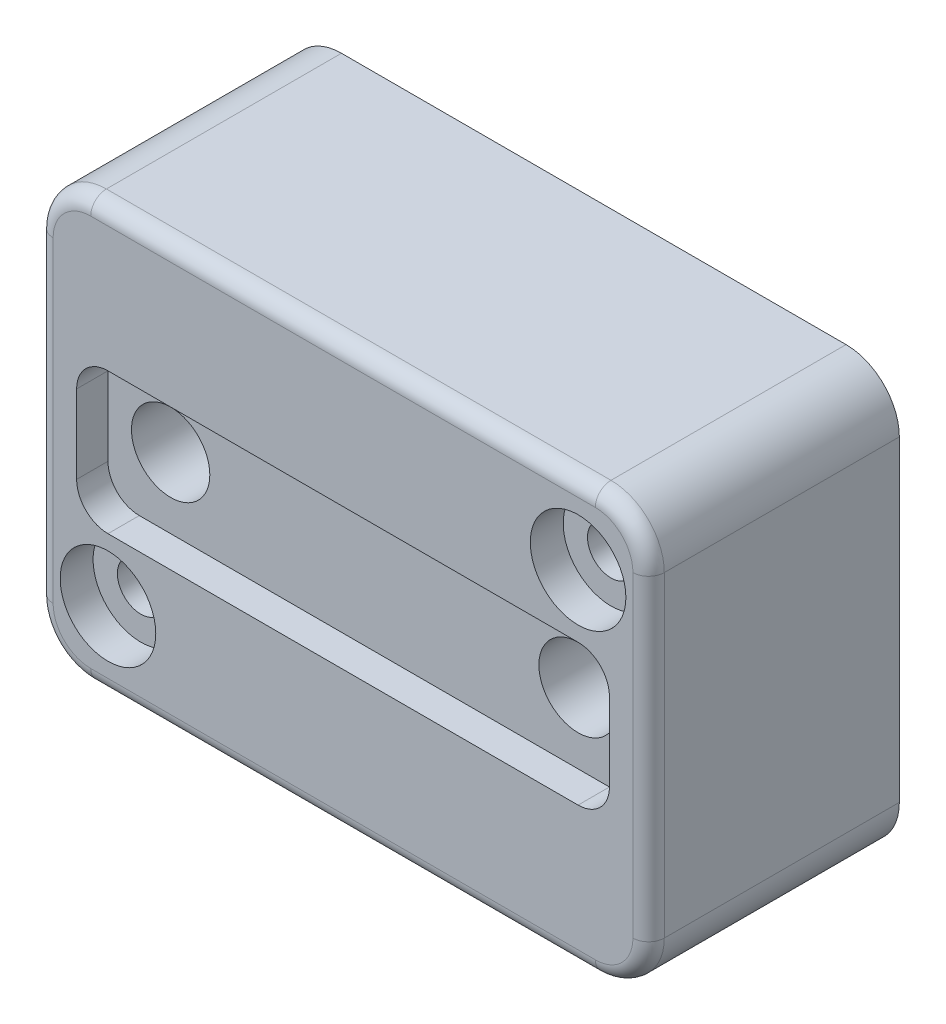
ISO-10303-21;
HEADER;
FILE_DESCRIPTION(('STEP AP214'),'2;1');
FILE_NAME('part.step','',(''),(''),'','','');
FILE_SCHEMA(('AUTOMOTIVE_DESIGN { 1 0 10303 214 1 1 1 1 }'));
ENDSEC;
DATA;
#1=APPLICATION_CONTEXT('core data for automotive mechanical design processes');
#2=APPLICATION_PROTOCOL_DEFINITION('international standard','automotive_design',2000,#1);
#3=PRODUCT_CONTEXT('',#1,'mechanical');
#4=PRODUCT('Part','Part','',(#3));
#5=PRODUCT_RELATED_PRODUCT_CATEGORY('part','',(#4));
#6=PRODUCT_DEFINITION_FORMATION('','',#4);
#7=PRODUCT_DEFINITION_CONTEXT('part definition',#1,'design');
#8=PRODUCT_DEFINITION('design','',#6,#7);
#9=PRODUCT_DEFINITION_SHAPE('','',#8);
#10=(LENGTH_UNIT() NAMED_UNIT(*) SI_UNIT(.MILLI.,.METRE.));
#11=(NAMED_UNIT(*) PLANE_ANGLE_UNIT() SI_UNIT($,.RADIAN.));
#12=(NAMED_UNIT(*) SI_UNIT($,.STERADIAN.) SOLID_ANGLE_UNIT());
#13=UNCERTAINTY_MEASURE_WITH_UNIT(LENGTH_MEASURE(1.E-05),#10,'distance_accuracy_value','');
#14=(GEOMETRIC_REPRESENTATION_CONTEXT(3) GLOBAL_UNCERTAINTY_ASSIGNED_CONTEXT((#13)) GLOBAL_UNIT_ASSIGNED_CONTEXT((#10,
#11,#12)) REPRESENTATION_CONTEXT('',''));
#15=CARTESIAN_POINT('',(0.,0.,0.));
#16=DIRECTION('',(0.,0.,1.));
#17=DIRECTION('',(1.,0.,0.));
#18=AXIS2_PLACEMENT_3D('',#15,#16,#17);
#19=CARTESIAN_POINT('',(15.,8.5,16.));
#20=DIRECTION('',(0.,0.,-1.));
#21=DIRECTION('',(-1.,0.,0.));
#22=AXIS2_PLACEMENT_3D('',#19,#20,#21);
#23=CYLINDRICAL_SURFACE('',#22,1.5);
#24=CARTESIAN_POINT('',(15.,8.5,0.));
#25=DIRECTION('',(0.,0.,1.));
#26=DIRECTION('',(1.,0.,0.));
#27=AXIS2_PLACEMENT_3D('',#24,#25,#26);
#28=CIRCLE('',#27,1.5);
#29=CARTESIAN_POINT('',(16.5,8.5,0.));
#30=VERTEX_POINT('',#29);
#31=EDGE_CURVE('E253',#30,#30,#28,.T.);
#32=ORIENTED_EDGE('',*,*,#31,.F.);
#33=EDGE_LOOP('',(#32));
#34=FACE_BOUND('',#33,.T.);
#35=CARTESIAN_POINT('',(15.,8.5,13.9));
#36=DIRECTION('',(0.,0.,1.));
#37=DIRECTION('',(1.,0.,0.));
#38=AXIS2_PLACEMENT_3D('',#35,#36,#37);
#39=CIRCLE('',#38,1.5);
#40=CARTESIAN_POINT('',(16.5,8.5,13.9));
#41=VERTEX_POINT('',#40);
#42=EDGE_CURVE('E300',#41,#41,#39,.T.);
#43=ORIENTED_EDGE('',*,*,#42,.T.);
#44=EDGE_LOOP('',(#43));
#45=FACE_BOUND('',#44,.T.);
#46=ADVANCED_FACE('F33',(#34,#45),#23,.F.);
#47=CARTESIAN_POINT('',(-15.,-8.5,16.));
#48=DIRECTION('',(0.,0.,-1.));
#49=DIRECTION('',(-1.,0.,0.));
#50=AXIS2_PLACEMENT_3D('',#47,#48,#49);
#51=CYLINDRICAL_SURFACE('',#50,1.5);
#52=CARTESIAN_POINT('',(-15.,-8.5,0.));
#53=DIRECTION('',(0.,0.,1.));
#54=DIRECTION('',(1.,0.,0.));
#55=AXIS2_PLACEMENT_3D('',#52,#53,#54);
#56=CIRCLE('',#55,1.5);
#57=CARTESIAN_POINT('',(-13.5,-8.5,0.));
#58=VERTEX_POINT('',#57);
#59=EDGE_CURVE('E239',#58,#58,#56,.T.);
#60=ORIENTED_EDGE('',*,*,#59,.F.);
#61=EDGE_LOOP('',(#60));
#62=FACE_BOUND('',#61,.T.);
#63=CARTESIAN_POINT('',(-15.,-8.5,13.9));
#64=DIRECTION('',(0.,0.,1.));
#65=DIRECTION('',(1.,0.,0.));
#66=AXIS2_PLACEMENT_3D('',#63,#64,#65);
#67=CIRCLE('',#66,1.5);
#68=CARTESIAN_POINT('',(-13.5,-8.5,13.9));
#69=VERTEX_POINT('',#68);
#70=EDGE_CURVE('E297',#69,#69,#67,.T.);
#71=ORIENTED_EDGE('',*,*,#70,.T.);
#72=EDGE_LOOP('',(#71));
#73=FACE_BOUND('',#72,.T.);
#74=ADVANCED_FACE('F384',(#62,#73),#51,.F.);
#75=CARTESIAN_POINT('',(15.,2.5,14.));
#76=DIRECTION('',(0.,0.,-1.));
#77=DIRECTION('',(-1.,0.,0.));
#78=AXIS2_PLACEMENT_3D('',#75,#76,#77);
#79=PLANE('',#78);
#80=CARTESIAN_POINT('',(-13.,0.,14.));
#81=DIRECTION('',(0.,0.,1.));
#82=DIRECTION('',(1.,0.,0.));
#83=AXIS2_PLACEMENT_3D('',#80,#81,#82);
#84=CIRCLE('',#83,2.5);
#85=CARTESIAN_POINT('',(-10.5,0.,14.));
#86=VERTEX_POINT('',#85);
#87=EDGE_CURVE('E372',#86,#86,#84,.T.);
#88=ORIENTED_EDGE('',*,*,#87,.F.);
#89=EDGE_LOOP('',(#88));
#90=FACE_BOUND('',#89,.T.);
#91=CARTESIAN_POINT('',(15.,2.5,14.));
#92=DIRECTION('',(0.,0.,1.));
#93=DIRECTION('',(-1.,0.,0.));
#94=AXIS2_PLACEMENT_3D('',#91,#92,#93);
#95=CIRCLE('',#94,2.);
#96=CARTESIAN_POINT('',(17.,2.49999999999998,14.));
#97=VERTEX_POINT('',#96);
#98=CARTESIAN_POINT('',(15.,4.5,14.));
#99=VERTEX_POINT('',#98);
#100=EDGE_CURVE('E175',#97,#99,#95,.T.);
#101=ORIENTED_EDGE('',*,*,#100,.T.);
#102=DIRECTION('',(-1.,0.,0.));
#103=VECTOR('',#102,1.);
#104=CARTESIAN_POINT('',(-15.,4.5,14.));
#105=LINE('',#104,#103);
#106=CARTESIAN_POINT('',(-15.,4.5,14.));
#107=VERTEX_POINT('',#106);
#108=EDGE_CURVE('E186',#99,#107,#105,.T.);
#109=ORIENTED_EDGE('',*,*,#108,.T.);
#110=CARTESIAN_POINT('',(-15.,2.5,14.));
#111=DIRECTION('',(0.,0.,1.));
#112=DIRECTION('',(1.,0.,0.));
#113=AXIS2_PLACEMENT_3D('',#110,#111,#112);
#114=CIRCLE('',#113,2.);
#115=CARTESIAN_POINT('',(-17.,2.49999999999998,14.));
#116=VERTEX_POINT('',#115);
#117=EDGE_CURVE('E191',#107,#116,#114,.T.);
#118=ORIENTED_EDGE('',*,*,#117,.T.);
#119=DIRECTION('',(0.,-1.,0.));
#120=VECTOR('',#119,1.);
#121=CARTESIAN_POINT('',(-17.,2.49999999999998,14.));
#122=LINE('',#121,#120);
#123=CARTESIAN_POINT('',(-17.,-2.49999999999999,14.));
#124=VERTEX_POINT('',#123);
#125=EDGE_CURVE('E207',#116,#124,#122,.T.);
#126=ORIENTED_EDGE('',*,*,#125,.T.);
#127=CARTESIAN_POINT('',(-15.,-2.5,14.));
#128=DIRECTION('',(0.,0.,1.));
#129=DIRECTION('',(1.,0.,0.));
#130=AXIS2_PLACEMENT_3D('',#127,#128,#129);
#131=CIRCLE('',#130,2.);
#132=CARTESIAN_POINT('',(-15.,-4.5,14.));
#133=VERTEX_POINT('',#132);
#134=EDGE_CURVE('E210',#124,#133,#131,.T.);
#135=ORIENTED_EDGE('',*,*,#134,.T.);
#136=DIRECTION('',(1.,0.,0.));
#137=VECTOR('',#136,1.);
#138=CARTESIAN_POINT('',(-15.,-4.5,14.));
#139=LINE('',#138,#137);
#140=CARTESIAN_POINT('',(15.,-4.5,14.));
#141=VERTEX_POINT('',#140);
#142=EDGE_CURVE('E213',#133,#141,#139,.T.);
#143=ORIENTED_EDGE('',*,*,#142,.T.);
#144=CARTESIAN_POINT('',(15.,-2.5,14.));
#145=DIRECTION('',(0.,0.,1.));
#146=DIRECTION('',(1.,0.,0.));
#147=AXIS2_PLACEMENT_3D('',#144,#145,#146);
#148=CIRCLE('',#147,2.);
#149=CARTESIAN_POINT('',(17.,-2.5,14.));
#150=VERTEX_POINT('',#149);
#151=EDGE_CURVE('E216',#141,#150,#148,.T.);
#152=ORIENTED_EDGE('',*,*,#151,.T.);
#153=DIRECTION('',(0.,1.,0.));
#154=VECTOR('',#153,1.);
#155=CARTESIAN_POINT('',(17.,2.49999999999998,14.));
#156=LINE('',#155,#154);
#157=EDGE_CURVE('E183',#150,#97,#156,.T.);
#158=ORIENTED_EDGE('',*,*,#157,.T.);
#159=EDGE_LOOP('',(#101,#109,#118,#126,#135,#143,#152,#158));
#160=FACE_BOUND('',#159,.T.);
#161=CARTESIAN_POINT('',(13.,0.,14.));
#162=DIRECTION('',(0.,0.,1.));
#163=DIRECTION('',(-1.,0.,0.));
#164=AXIS2_PLACEMENT_3D('',#161,#162,#163);
#165=CIRCLE('',#164,2.5);
#166=CARTESIAN_POINT('',(10.5,0.,14.));
#167=VERTEX_POINT('',#166);
#168=EDGE_CURVE('E203',#167,#167,#165,.T.);
#169=ORIENTED_EDGE('',*,*,#168,.F.);
#170=EDGE_LOOP('',(#169));
#171=FACE_BOUND('',#170,.T.);
#172=ADVANCED_FACE('F193',(#90,#160,#171),#79,.F.);
#173=CARTESIAN_POINT('',(16.1,10.1,16.));
#174=DIRECTION('',(0.,0.,-1.));
#175=DIRECTION('',(-1.,0.,0.));
#176=AXIS2_PLACEMENT_3D('',#173,#174,#175);
#177=PLANE('',#176);
#178=DIRECTION('',(1.,0.,0.));
#179=VECTOR('',#178,1.);
#180=CARTESIAN_POINT('',(16.1,-12.5,16.));
#181=LINE('',#180,#179);
#182=CARTESIAN_POINT('',(-16.1,-12.5,16.));
#183=VERTEX_POINT('',#182);
#184=CARTESIAN_POINT('',(16.1,-12.5,16.));
#185=VERTEX_POINT('',#184);
#186=EDGE_CURVE('E314',#183,#185,#181,.T.);
#187=ORIENTED_EDGE('',*,*,#186,.T.);
#188=CARTESIAN_POINT('',(16.1,-10.1,16.));
#189=DIRECTION('',(0.,0.,-1.));
#190=DIRECTION('',(-1.,0.,0.));
#191=AXIS2_PLACEMENT_3D('',#188,#189,#190);
#192=CIRCLE('',#191,2.4);
#193=CARTESIAN_POINT('',(18.5,-10.1,16.));
#194=VERTEX_POINT('',#193);
#195=EDGE_CURVE('E318',#185,#194,#192,.F.);
#196=ORIENTED_EDGE('',*,*,#195,.T.);
#197=DIRECTION('',(0.,1.,0.));
#198=VECTOR('',#197,1.);
#199=CARTESIAN_POINT('',(18.5,10.1,16.));
#200=LINE('',#199,#198);
#201=CARTESIAN_POINT('',(18.5,10.1,16.));
#202=VERTEX_POINT('',#201);
#203=EDGE_CURVE('E316',#194,#202,#200,.T.);
#204=ORIENTED_EDGE('',*,*,#203,.T.);
#205=CARTESIAN_POINT('',(16.1,10.1,16.));
#206=DIRECTION('',(0.,0.,-1.));
#207=DIRECTION('',(-1.,0.,0.));
#208=AXIS2_PLACEMENT_3D('',#205,#206,#207);
#209=CIRCLE('',#208,2.4);
#210=CARTESIAN_POINT('',(16.1,12.5,16.));
#211=VERTEX_POINT('',#210);
#212=EDGE_CURVE('E312',#202,#211,#209,.F.);
#213=ORIENTED_EDGE('',*,*,#212,.T.);
#214=DIRECTION('',(-1.,0.,0.));
#215=VECTOR('',#214,1.);
#216=CARTESIAN_POINT('',(16.1,12.5,16.));
#217=LINE('',#216,#215);
#218=CARTESIAN_POINT('',(-16.1,12.5,16.));
#219=VERTEX_POINT('',#218);
#220=EDGE_CURVE('E310',#211,#219,#217,.T.);
#221=ORIENTED_EDGE('',*,*,#220,.T.);
#222=CARTESIAN_POINT('',(-16.1,10.1,16.));
#223=DIRECTION('',(0.,0.,-1.));
#224=DIRECTION('',(-1.,0.,0.));
#225=AXIS2_PLACEMENT_3D('',#222,#223,#224);
#226=CIRCLE('',#225,2.4);
#227=CARTESIAN_POINT('',(-18.5,10.1,16.));
#228=VERTEX_POINT('',#227);
#229=EDGE_CURVE('E307',#219,#228,#226,.F.);
#230=ORIENTED_EDGE('',*,*,#229,.T.);
#231=DIRECTION('',(0.,-1.,0.));
#232=VECTOR('',#231,1.);
#233=CARTESIAN_POINT('',(-18.5,10.1,16.));
#234=LINE('',#233,#232);
#235=CARTESIAN_POINT('',(-18.5,-10.1,16.));
#236=VERTEX_POINT('',#235);
#237=EDGE_CURVE('E296',#228,#236,#234,.T.);
#238=ORIENTED_EDGE('',*,*,#237,.T.);
#239=CARTESIAN_POINT('',(-16.1,-10.1,16.));
#240=DIRECTION('',(0.,0.,-1.));
#241=DIRECTION('',(-1.,0.,0.));
#242=AXIS2_PLACEMENT_3D('',#239,#240,#241);
#243=CIRCLE('',#242,2.4);
#244=EDGE_CURVE('E305',#236,#183,#243,.F.);
#245=ORIENTED_EDGE('',*,*,#244,.T.);
#246=EDGE_LOOP('',(#187,#196,#204,#213,#221,#230,#238,#245));
#247=FACE_BOUND('',#246,.T.);
#248=CARTESIAN_POINT('',(15.,8.5,16.));
#249=DIRECTION('',(0.,0.,1.));
#250=DIRECTION('',(1.,0.,0.));
#251=AXIS2_PLACEMENT_3D('',#248,#249,#250);
#252=CIRCLE('',#251,3.05);
#253=CARTESIAN_POINT('',(18.05,8.5,16.));
#254=VERTEX_POINT('',#253);
#255=EDGE_CURVE('E366',#254,#254,#252,.T.);
#256=ORIENTED_EDGE('',*,*,#255,.F.);
#257=EDGE_LOOP('',(#256));
#258=FACE_BOUND('',#257,.T.);
#259=CARTESIAN_POINT('',(-15.,-8.5,16.));
#260=DIRECTION('',(0.,0.,1.));
#261=DIRECTION('',(1.,0.,0.));
#262=AXIS2_PLACEMENT_3D('',#259,#260,#261);
#263=CIRCLE('',#262,3.05);
#264=CARTESIAN_POINT('',(-11.95,-8.5,16.));
#265=VERTEX_POINT('',#264);
#266=EDGE_CURVE('E355',#265,#265,#263,.T.);
#267=ORIENTED_EDGE('',*,*,#266,.F.);
#268=EDGE_LOOP('',(#267));
#269=FACE_BOUND('',#268,.T.);
#270=DIRECTION('',(-1.,0.,0.));
#271=VECTOR('',#270,1.);
#272=CARTESIAN_POINT('',(-15.,4.5,16.));
#273=LINE('',#272,#271);
#274=CARTESIAN_POINT('',(15.,4.5,16.));
#275=VERTEX_POINT('',#274);
#276=CARTESIAN_POINT('',(-15.,4.5,16.));
#277=VERTEX_POINT('',#276);
#278=EDGE_CURVE('E220',#275,#277,#273,.T.);
#279=ORIENTED_EDGE('',*,*,#278,.F.);
#280=CARTESIAN_POINT('',(15.,2.5,16.));
#281=DIRECTION('',(0.,0.,1.));
#282=DIRECTION('',(-1.,0.,0.));
#283=AXIS2_PLACEMENT_3D('',#280,#281,#282);
#284=CIRCLE('',#283,2.);
#285=CARTESIAN_POINT('',(17.,2.49999999999998,16.));
#286=VERTEX_POINT('',#285);
#287=EDGE_CURVE('E178',#286,#275,#284,.T.);
#288=ORIENTED_EDGE('',*,*,#287,.F.);
#289=DIRECTION('',(0.,1.,0.));
#290=VECTOR('',#289,1.);
#291=CARTESIAN_POINT('',(17.,2.49999999999998,16.));
#292=LINE('',#291,#290);
#293=CARTESIAN_POINT('',(17.,-2.5,16.));
#294=VERTEX_POINT('',#293);
#295=EDGE_CURVE('E197',#294,#286,#292,.T.);
#296=ORIENTED_EDGE('',*,*,#295,.F.);
#297=CARTESIAN_POINT('',(15.,-2.5,16.));
#298=DIRECTION('',(0.,0.,1.));
#299=DIRECTION('',(1.,0.,0.));
#300=AXIS2_PLACEMENT_3D('',#297,#298,#299);
#301=CIRCLE('',#300,2.);
#302=CARTESIAN_POINT('',(15.,-4.5,16.));
#303=VERTEX_POINT('',#302);
#304=EDGE_CURVE('E200',#303,#294,#301,.T.);
#305=ORIENTED_EDGE('',*,*,#304,.F.);
#306=DIRECTION('',(1.,0.,0.));
#307=VECTOR('',#306,1.);
#308=CARTESIAN_POINT('',(-15.,-4.5,16.));
#309=LINE('',#308,#307);
#310=CARTESIAN_POINT('',(-15.,-4.5,16.));
#311=VERTEX_POINT('',#310);
#312=EDGE_CURVE('E232',#311,#303,#309,.T.);
#313=ORIENTED_EDGE('',*,*,#312,.F.);
#314=CARTESIAN_POINT('',(-15.,-2.5,16.));
#315=DIRECTION('',(0.,0.,1.));
#316=DIRECTION('',(1.,0.,0.));
#317=AXIS2_PLACEMENT_3D('',#314,#315,#316);
#318=CIRCLE('',#317,2.);
#319=CARTESIAN_POINT('',(-17.,-2.49999999999999,16.));
#320=VERTEX_POINT('',#319);
#321=EDGE_CURVE('E229',#320,#311,#318,.T.);
#322=ORIENTED_EDGE('',*,*,#321,.F.);
#323=DIRECTION('',(0.,-1.,0.));
#324=VECTOR('',#323,1.);
#325=CARTESIAN_POINT('',(-17.,2.49999999999998,16.));
#326=LINE('',#325,#324);
#327=CARTESIAN_POINT('',(-17.,2.49999999999998,16.));
#328=VERTEX_POINT('',#327);
#329=EDGE_CURVE('E226',#328,#320,#326,.T.);
#330=ORIENTED_EDGE('',*,*,#329,.F.);
#331=CARTESIAN_POINT('',(-15.,2.5,16.));
#332=DIRECTION('',(0.,0.,1.));
#333=DIRECTION('',(1.,0.,0.));
#334=AXIS2_PLACEMENT_3D('',#331,#332,#333);
#335=CIRCLE('',#334,2.);
#336=EDGE_CURVE('E223',#277,#328,#335,.T.);
#337=ORIENTED_EDGE('',*,*,#336,.F.);
#338=EDGE_LOOP('',(#279,#288,#296,#305,#313,#322,#330,#337));
#339=FACE_BOUND('',#338,.T.);
#340=ADVANCED_FACE('F383',(#247,#258,#269,#339),#177,.F.);
#341=CARTESIAN_POINT('',(16.1,10.1,0.));
#342=DIRECTION('',(0.,0.,-1.));
#343=DIRECTION('',(-1.,0.,0.));
#344=AXIS2_PLACEMENT_3D('',#341,#342,#343);
#345=PLANE('',#344);
#346=CARTESIAN_POINT('',(-13.,0.,0.));
#347=DIRECTION('',(0.,0.,1.));
#348=DIRECTION('',(1.,0.,0.));
#349=AXIS2_PLACEMENT_3D('',#346,#347,#348);
#350=CIRCLE('',#349,2.5);
#351=CARTESIAN_POINT('',(-10.5,0.,0.));
#352=VERTEX_POINT('',#351);
#353=EDGE_CURVE('E221',#352,#352,#350,.T.);
#354=ORIENTED_EDGE('',*,*,#353,.T.);
#355=EDGE_LOOP('',(#354));
#356=FACE_BOUND('',#355,.T.);
#357=CARTESIAN_POINT('',(13.,0.,0.));
#358=DIRECTION('',(0.,0.,1.));
#359=DIRECTION('',(-1.,0.,0.));
#360=AXIS2_PLACEMENT_3D('',#357,#358,#359);
#361=CIRCLE('',#360,2.5);
#362=CARTESIAN_POINT('',(10.5,0.,0.));
#363=VERTEX_POINT('',#362);
#364=EDGE_CURVE('E374',#363,#363,#361,.T.);
#365=ORIENTED_EDGE('',*,*,#364,.T.);
#366=EDGE_LOOP('',(#365));
#367=FACE_BOUND('',#366,.T.);
#368=ORIENTED_EDGE('',*,*,#31,.T.);
#369=EDGE_LOOP('',(#368));
#370=FACE_BOUND('',#369,.T.);
#371=CARTESIAN_POINT('',(16.1,10.1,0.));
#372=DIRECTION('',(0.,0.,1.));
#373=DIRECTION('',(-1.,0.,0.));
#374=AXIS2_PLACEMENT_3D('',#371,#372,#373);
#375=CIRCLE('',#374,3.4);
#376=CARTESIAN_POINT('',(19.5,10.1,0.));
#377=VERTEX_POINT('',#376);
#378=CARTESIAN_POINT('',(16.1,13.5,0.));
#379=VERTEX_POINT('',#378);
#380=EDGE_CURVE('E256',#377,#379,#375,.T.);
#381=ORIENTED_EDGE('',*,*,#380,.F.);
#382=DIRECTION('',(0.,1.,0.));
#383=VECTOR('',#382,1.);
#384=CARTESIAN_POINT('',(19.5,10.1,0.));
#385=LINE('',#384,#383);
#386=CARTESIAN_POINT('',(19.5,-10.1,0.));
#387=VERTEX_POINT('',#386);
#388=EDGE_CURVE('E277',#387,#377,#385,.T.);
#389=ORIENTED_EDGE('',*,*,#388,.F.);
#390=CARTESIAN_POINT('',(16.1,-10.1,0.));
#391=DIRECTION('',(0.,0.,1.));
#392=DIRECTION('',(1.,0.,0.));
#393=AXIS2_PLACEMENT_3D('',#390,#391,#392);
#394=CIRCLE('',#393,3.4);
#395=CARTESIAN_POINT('',(16.1,-13.5,0.));
#396=VERTEX_POINT('',#395);
#397=EDGE_CURVE('E274',#396,#387,#394,.T.);
#398=ORIENTED_EDGE('',*,*,#397,.F.);
#399=DIRECTION('',(1.,0.,0.));
#400=VECTOR('',#399,1.);
#401=CARTESIAN_POINT('',(-16.1,-13.5,0.));
#402=LINE('',#401,#400);
#403=CARTESIAN_POINT('',(-16.1,-13.5,0.));
#404=VERTEX_POINT('',#403);
#405=EDGE_CURVE('E271',#404,#396,#402,.T.);
#406=ORIENTED_EDGE('',*,*,#405,.F.);
#407=CARTESIAN_POINT('',(-16.1,-10.1,0.));
#408=DIRECTION('',(0.,0.,1.));
#409=DIRECTION('',(1.,0.,0.));
#410=AXIS2_PLACEMENT_3D('',#407,#408,#409);
#411=CIRCLE('',#410,3.4);
#412=CARTESIAN_POINT('',(-19.5,-10.1,0.));
#413=VERTEX_POINT('',#412);
#414=EDGE_CURVE('E268',#413,#404,#411,.T.);
#415=ORIENTED_EDGE('',*,*,#414,.F.);
#416=DIRECTION('',(0.,-1.,0.));
#417=VECTOR('',#416,1.);
#418=CARTESIAN_POINT('',(-19.5,10.1,0.));
#419=LINE('',#418,#417);
#420=CARTESIAN_POINT('',(-19.5,10.1,0.));
#421=VERTEX_POINT('',#420);
#422=EDGE_CURVE('E265',#421,#413,#419,.T.);
#423=ORIENTED_EDGE('',*,*,#422,.F.);
#424=CARTESIAN_POINT('',(-16.1,10.1,0.));
#425=DIRECTION('',(0.,0.,1.));
#426=DIRECTION('',(1.,0.,0.));
#427=AXIS2_PLACEMENT_3D('',#424,#425,#426);
#428=CIRCLE('',#427,3.4);
#429=CARTESIAN_POINT('',(-16.1,13.5,0.));
#430=VERTEX_POINT('',#429);
#431=EDGE_CURVE('E262',#430,#421,#428,.T.);
#432=ORIENTED_EDGE('',*,*,#431,.F.);
#433=DIRECTION('',(-1.,0.,0.));
#434=VECTOR('',#433,1.);
#435=CARTESIAN_POINT('',(-16.1,13.5,0.));
#436=LINE('',#435,#434);
#437=EDGE_CURVE('E259',#379,#430,#436,.T.);
#438=ORIENTED_EDGE('',*,*,#437,.F.);
#439=EDGE_LOOP('',(#381,#389,#398,#406,#415,#423,#432,#438));
#440=FACE_BOUND('',#439,.T.);
#441=ORIENTED_EDGE('',*,*,#59,.T.);
#442=EDGE_LOOP('',(#441));
#443=FACE_BOUND('',#442,.T.);
#444=ADVANCED_FACE('F392',(#356,#367,#370,#440,#443),#345,.T.);
#445=CARTESIAN_POINT('',(16.1,10.1,16.));
#446=DIRECTION('',(0.,0.,-1.));
#447=DIRECTION('',(-1.,0.,0.));
#448=AXIS2_PLACEMENT_3D('',#445,#446,#447);
#449=CYLINDRICAL_SURFACE('',#448,3.4);
#450=DIRECTION('',(0.,0.,-1.));
#451=VECTOR('',#450,1.);
#452=CARTESIAN_POINT('',(16.1,13.5,16.));
#453=LINE('',#452,#451);
#454=CARTESIAN_POINT('',(16.1,13.5,15.));
#455=VERTEX_POINT('',#454);
#456=EDGE_CURVE('E294',#455,#379,#453,.T.);
#457=ORIENTED_EDGE('',*,*,#456,.F.);
#458=CARTESIAN_POINT('',(16.1,10.1,15.));
#459=DIRECTION('',(0.,0.,-1.));
#460=DIRECTION('',(-1.,0.,0.));
#461=AXIS2_PLACEMENT_3D('',#458,#459,#460);
#462=CIRCLE('',#461,3.4);
#463=CARTESIAN_POINT('',(19.5,10.1,15.));
#464=VERTEX_POINT('',#463);
#465=EDGE_CURVE('E50',#455,#464,#462,.T.);
#466=ORIENTED_EDGE('',*,*,#465,.T.);
#467=DIRECTION('',(0.,0.,-1.));
#468=VECTOR('',#467,1.);
#469=CARTESIAN_POINT('',(19.5,10.1,16.));
#470=LINE('',#469,#468);
#471=EDGE_CURVE('E280',#464,#377,#470,.T.);
#472=ORIENTED_EDGE('',*,*,#471,.T.);
#473=ORIENTED_EDGE('',*,*,#380,.T.);
#474=EDGE_LOOP('',(#457,#466,#472,#473));
#475=FACE_BOUND('',#474,.T.);
#476=ADVANCED_FACE('F413',(#475),#449,.T.);
#477=CARTESIAN_POINT('',(-16.1,13.5,16.));
#478=DIRECTION('',(0.,-1.,0.));
#479=DIRECTION('',(0.,0.,-1.));
#480=AXIS2_PLACEMENT_3D('',#477,#478,#479);
#481=PLANE('',#480);
#482=DIRECTION('',(0.,0.,-1.));
#483=VECTOR('',#482,1.);
#484=CARTESIAN_POINT('',(-16.1,13.5,16.));
#485=LINE('',#484,#483);
#486=CARTESIAN_POINT('',(-16.1,13.5,15.));
#487=VERTEX_POINT('',#486);
#488=EDGE_CURVE('E292',#487,#430,#485,.T.);
#489=ORIENTED_EDGE('',*,*,#488,.F.);
#490=DIRECTION('',(-1.,0.,0.));
#491=VECTOR('',#490,1.);
#492=CARTESIAN_POINT('',(-16.1,13.5,15.));
#493=LINE('',#492,#491);
#494=EDGE_CURVE('E42',#487,#455,#493,.F.);
#495=ORIENTED_EDGE('',*,*,#494,.T.);
#496=ORIENTED_EDGE('',*,*,#456,.T.);
#497=ORIENTED_EDGE('',*,*,#437,.T.);
#498=EDGE_LOOP('',(#489,#495,#496,#497));
#499=FACE_BOUND('',#498,.T.);
#500=ADVANCED_FACE('F438',(#499),#481,.F.);
#501=CARTESIAN_POINT('',(-16.1,10.1,16.));
#502=DIRECTION('',(0.,0.,-1.));
#503=DIRECTION('',(-1.,0.,0.));
#504=AXIS2_PLACEMENT_3D('',#501,#502,#503);
#505=CYLINDRICAL_SURFACE('',#504,3.4);
#506=DIRECTION('',(0.,0.,-1.));
#507=VECTOR('',#506,1.);
#508=CARTESIAN_POINT('',(-19.5,10.1,16.));
#509=LINE('',#508,#507);
#510=CARTESIAN_POINT('',(-19.5,10.1,15.));
#511=VERTEX_POINT('',#510);
#512=EDGE_CURVE('E290',#511,#421,#509,.T.);
#513=ORIENTED_EDGE('',*,*,#512,.F.);
#514=CARTESIAN_POINT('',(-16.1,10.1,15.));
#515=DIRECTION('',(0.,0.,-1.));
#516=DIRECTION('',(-1.,0.,0.));
#517=AXIS2_PLACEMENT_3D('',#514,#515,#516);
#518=CIRCLE('',#517,3.4);
#519=EDGE_CURVE('E320',#511,#487,#518,.T.);
#520=ORIENTED_EDGE('',*,*,#519,.T.);
#521=ORIENTED_EDGE('',*,*,#488,.T.);
#522=ORIENTED_EDGE('',*,*,#431,.T.);
#523=EDGE_LOOP('',(#513,#520,#521,#522));
#524=FACE_BOUND('',#523,.T.);
#525=ADVANCED_FACE('F434',(#524),#505,.T.);
#526=CARTESIAN_POINT('',(-19.5,10.1,16.));
#527=DIRECTION('',(1.,0.,0.));
#528=DIRECTION('',(0.,0.,-1.));
#529=AXIS2_PLACEMENT_3D('',#526,#527,#528);
#530=PLANE('',#529);
#531=DIRECTION('',(0.,0.,-1.));
#532=VECTOR('',#531,1.);
#533=CARTESIAN_POINT('',(-19.5,-10.1,16.));
#534=LINE('',#533,#532);
#535=CARTESIAN_POINT('',(-19.5,-10.1,15.));
#536=VERTEX_POINT('',#535);
#537=EDGE_CURVE('E288',#536,#413,#534,.T.);
#538=ORIENTED_EDGE('',*,*,#537,.F.);
#539=DIRECTION('',(0.,-1.,0.));
#540=VECTOR('',#539,1.);
#541=CARTESIAN_POINT('',(-19.5,10.1,15.));
#542=LINE('',#541,#540);
#543=EDGE_CURVE('E11',#536,#511,#542,.F.);
#544=ORIENTED_EDGE('',*,*,#543,.T.);
#545=ORIENTED_EDGE('',*,*,#512,.T.);
#546=ORIENTED_EDGE('',*,*,#422,.T.);
#547=EDGE_LOOP('',(#538,#544,#545,#546));
#548=FACE_BOUND('',#547,.T.);
#549=ADVANCED_FACE('F430',(#548),#530,.F.);
#550=CARTESIAN_POINT('',(-16.1,-10.1,16.));
#551=DIRECTION('',(0.,0.,-1.));
#552=DIRECTION('',(-1.,0.,0.));
#553=AXIS2_PLACEMENT_3D('',#550,#551,#552);
#554=CYLINDRICAL_SURFACE('',#553,3.4);
#555=DIRECTION('',(0.,0.,-1.));
#556=VECTOR('',#555,1.);
#557=CARTESIAN_POINT('',(-16.1,-13.5,16.));
#558=LINE('',#557,#556);
#559=CARTESIAN_POINT('',(-16.1,-13.5,15.));
#560=VERTEX_POINT('',#559);
#561=EDGE_CURVE('E286',#560,#404,#558,.T.);
#562=ORIENTED_EDGE('',*,*,#561,.F.);
#563=CARTESIAN_POINT('',(-16.1,-10.1,15.));
#564=DIRECTION('',(0.,0.,-1.));
#565=DIRECTION('',(-1.,0.,0.));
#566=AXIS2_PLACEMENT_3D('',#563,#564,#565);
#567=CIRCLE('',#566,3.4);
#568=EDGE_CURVE('E323',#560,#536,#567,.T.);
#569=ORIENTED_EDGE('',*,*,#568,.T.);
#570=ORIENTED_EDGE('',*,*,#537,.T.);
#571=ORIENTED_EDGE('',*,*,#414,.T.);
#572=EDGE_LOOP('',(#562,#569,#570,#571));
#573=FACE_BOUND('',#572,.T.);
#574=ADVANCED_FACE('F426',(#573),#554,.T.);
#575=CARTESIAN_POINT('',(-16.1,-13.5,16.));
#576=DIRECTION('',(0.,1.,0.));
#577=DIRECTION('',(0.,0.,1.));
#578=AXIS2_PLACEMENT_3D('',#575,#576,#577);
#579=PLANE('',#578);
#580=DIRECTION('',(0.,0.,-1.));
#581=VECTOR('',#580,1.);
#582=CARTESIAN_POINT('',(16.1,-13.5,16.));
#583=LINE('',#582,#581);
#584=CARTESIAN_POINT('',(16.1,-13.5,15.));
#585=VERTEX_POINT('',#584);
#586=EDGE_CURVE('E284',#585,#396,#583,.T.);
#587=ORIENTED_EDGE('',*,*,#586,.F.);
#588=DIRECTION('',(1.,0.,0.));
#589=VECTOR('',#588,1.);
#590=CARTESIAN_POINT('',(-16.1,-13.5,15.));
#591=LINE('',#590,#589);
#592=EDGE_CURVE('E325',#585,#560,#591,.F.);
#593=ORIENTED_EDGE('',*,*,#592,.T.);
#594=ORIENTED_EDGE('',*,*,#561,.T.);
#595=ORIENTED_EDGE('',*,*,#405,.T.);
#596=EDGE_LOOP('',(#587,#593,#594,#595));
#597=FACE_BOUND('',#596,.T.);
#598=ADVANCED_FACE('F422',(#597),#579,.F.);
#599=CARTESIAN_POINT('',(16.1,-10.1,16.));
#600=DIRECTION('',(0.,0.,-1.));
#601=DIRECTION('',(-1.,0.,0.));
#602=AXIS2_PLACEMENT_3D('',#599,#600,#601);
#603=CYLINDRICAL_SURFACE('',#602,3.4);
#604=DIRECTION('',(0.,0.,-1.));
#605=VECTOR('',#604,1.);
#606=CARTESIAN_POINT('',(19.5,-10.1,16.));
#607=LINE('',#606,#605);
#608=CARTESIAN_POINT('',(19.5,-10.1,15.));
#609=VERTEX_POINT('',#608);
#610=EDGE_CURVE('E282',#609,#387,#607,.T.);
#611=ORIENTED_EDGE('',*,*,#610,.F.);
#612=CARTESIAN_POINT('',(16.1,-10.1,15.));
#613=DIRECTION('',(0.,0.,-1.));
#614=DIRECTION('',(-1.,0.,0.));
#615=AXIS2_PLACEMENT_3D('',#612,#613,#614);
#616=CIRCLE('',#615,3.4);
#617=EDGE_CURVE('E327',#609,#585,#616,.T.);
#618=ORIENTED_EDGE('',*,*,#617,.T.);
#619=ORIENTED_EDGE('',*,*,#586,.T.);
#620=ORIENTED_EDGE('',*,*,#397,.T.);
#621=EDGE_LOOP('',(#611,#618,#619,#620));
#622=FACE_BOUND('',#621,.T.);
#623=ADVANCED_FACE('F418',(#622),#603,.T.);
#624=CARTESIAN_POINT('',(19.5,10.1,16.));
#625=DIRECTION('',(-1.,0.,0.));
#626=DIRECTION('',(0.,0.,1.));
#627=AXIS2_PLACEMENT_3D('',#624,#625,#626);
#628=PLANE('',#627);
#629=ORIENTED_EDGE('',*,*,#471,.F.);
#630=DIRECTION('',(0.,1.,0.));
#631=VECTOR('',#630,1.);
#632=CARTESIAN_POINT('',(19.5,10.1,15.));
#633=LINE('',#632,#631);
#634=EDGE_CURVE('E330',#464,#609,#633,.F.);
#635=ORIENTED_EDGE('',*,*,#634,.T.);
#636=ORIENTED_EDGE('',*,*,#610,.T.);
#637=ORIENTED_EDGE('',*,*,#388,.T.);
#638=EDGE_LOOP('',(#629,#635,#636,#637));
#639=FACE_BOUND('',#638,.T.);
#640=ADVANCED_FACE('F415',(#639),#628,.F.);
#641=CARTESIAN_POINT('',(15.,2.5,14.));
#642=DIRECTION('',(0.,0.,1.));
#643=DIRECTION('',(1.,0.,0.));
#644=AXIS2_PLACEMENT_3D('',#641,#642,#643);
#645=CYLINDRICAL_SURFACE('',#644,2.);
#646=ORIENTED_EDGE('',*,*,#287,.T.);
#647=DIRECTION('',(0.,0.,1.));
#648=VECTOR('',#647,1.);
#649=CARTESIAN_POINT('',(15.,4.5,14.));
#650=LINE('',#649,#648);
#651=EDGE_CURVE('E171',#99,#275,#650,.T.);
#652=ORIENTED_EDGE('',*,*,#651,.F.);
#653=ORIENTED_EDGE('',*,*,#100,.F.);
#654=DIRECTION('',(0.,0.,1.));
#655=VECTOR('',#654,1.);
#656=CARTESIAN_POINT('',(17.,2.49999999999998,14.));
#657=LINE('',#656,#655);
#658=EDGE_CURVE('E237',#97,#286,#657,.T.);
#659=ORIENTED_EDGE('',*,*,#658,.T.);
#660=EDGE_LOOP('',(#646,#652,#653,#659));
#661=FACE_BOUND('',#660,.T.);
#662=ADVANCED_FACE('F173',(#661),#645,.F.);
#663=CARTESIAN_POINT('',(17.,2.49999999999998,14.));
#664=DIRECTION('',(1.,0.,0.));
#665=DIRECTION('',(0.,0.,-1.));
#666=AXIS2_PLACEMENT_3D('',#663,#664,#665);
#667=PLANE('',#666);
#668=ORIENTED_EDGE('',*,*,#295,.T.);
#669=ORIENTED_EDGE('',*,*,#658,.F.);
#670=ORIENTED_EDGE('',*,*,#157,.F.);
#671=DIRECTION('',(0.,0.,1.));
#672=VECTOR('',#671,1.);
#673=CARTESIAN_POINT('',(17.,-2.5,14.));
#674=LINE('',#673,#672);
#675=EDGE_CURVE('E240',#150,#294,#674,.T.);
#676=ORIENTED_EDGE('',*,*,#675,.T.);
#677=EDGE_LOOP('',(#668,#669,#670,#676));
#678=FACE_BOUND('',#677,.T.);
#679=ADVANCED_FACE('F534',(#678),#667,.F.);
#680=CARTESIAN_POINT('',(15.,-2.5,14.));
#681=DIRECTION('',(0.,0.,1.));
#682=DIRECTION('',(1.,0.,0.));
#683=AXIS2_PLACEMENT_3D('',#680,#681,#682);
#684=CYLINDRICAL_SURFACE('',#683,2.);
#685=ORIENTED_EDGE('',*,*,#304,.T.);
#686=ORIENTED_EDGE('',*,*,#675,.F.);
#687=ORIENTED_EDGE('',*,*,#151,.F.);
#688=DIRECTION('',(0.,0.,1.));
#689=VECTOR('',#688,1.);
#690=CARTESIAN_POINT('',(15.,-4.5,14.));
#691=LINE('',#690,#689);
#692=EDGE_CURVE('E242',#141,#303,#691,.T.);
#693=ORIENTED_EDGE('',*,*,#692,.T.);
#694=EDGE_LOOP('',(#685,#686,#687,#693));
#695=FACE_BOUND('',#694,.T.);
#696=ADVANCED_FACE('F536',(#695),#684,.F.);
#697=CARTESIAN_POINT('',(-15.,-4.5,14.));
#698=DIRECTION('',(0.,-1.,0.));
#699=DIRECTION('',(0.,0.,-1.));
#700=AXIS2_PLACEMENT_3D('',#697,#698,#699);
#701=PLANE('',#700);
#702=ORIENTED_EDGE('',*,*,#312,.T.);
#703=ORIENTED_EDGE('',*,*,#692,.F.);
#704=ORIENTED_EDGE('',*,*,#142,.F.);
#705=DIRECTION('',(0.,0.,1.));
#706=VECTOR('',#705,1.);
#707=CARTESIAN_POINT('',(-15.,-4.5,14.));
#708=LINE('',#707,#706);
#709=EDGE_CURVE('E244',#133,#311,#708,.T.);
#710=ORIENTED_EDGE('',*,*,#709,.T.);
#711=EDGE_LOOP('',(#702,#703,#704,#710));
#712=FACE_BOUND('',#711,.T.);
#713=ADVANCED_FACE('F530',(#712),#701,.F.);
#714=CARTESIAN_POINT('',(-15.,-2.5,14.));
#715=DIRECTION('',(0.,0.,1.));
#716=DIRECTION('',(1.,0.,0.));
#717=AXIS2_PLACEMENT_3D('',#714,#715,#716);
#718=CYLINDRICAL_SURFACE('',#717,2.);
#719=ORIENTED_EDGE('',*,*,#321,.T.);
#720=ORIENTED_EDGE('',*,*,#709,.F.);
#721=ORIENTED_EDGE('',*,*,#134,.F.);
#722=DIRECTION('',(0.,0.,1.));
#723=VECTOR('',#722,1.);
#724=CARTESIAN_POINT('',(-17.,-2.49999999999999,14.));
#725=LINE('',#724,#723);
#726=EDGE_CURVE('E246',#124,#320,#725,.T.);
#727=ORIENTED_EDGE('',*,*,#726,.T.);
#728=EDGE_LOOP('',(#719,#720,#721,#727));
#729=FACE_BOUND('',#728,.T.);
#730=ADVANCED_FACE('F526',(#729),#718,.F.);
#731=CARTESIAN_POINT('',(-17.,2.49999999999998,14.));
#732=DIRECTION('',(-1.,0.,0.));
#733=DIRECTION('',(0.,0.,1.));
#734=AXIS2_PLACEMENT_3D('',#731,#732,#733);
#735=PLANE('',#734);
#736=ORIENTED_EDGE('',*,*,#329,.T.);
#737=ORIENTED_EDGE('',*,*,#726,.F.);
#738=ORIENTED_EDGE('',*,*,#125,.F.);
#739=DIRECTION('',(0.,0.,1.));
#740=VECTOR('',#739,1.);
#741=CARTESIAN_POINT('',(-17.,2.49999999999998,14.));
#742=LINE('',#741,#740);
#743=EDGE_CURVE('E248',#116,#328,#742,.T.);
#744=ORIENTED_EDGE('',*,*,#743,.T.);
#745=EDGE_LOOP('',(#736,#737,#738,#744));
#746=FACE_BOUND('',#745,.T.);
#747=ADVANCED_FACE('F524',(#746),#735,.F.);
#748=CARTESIAN_POINT('',(-15.,2.5,14.));
#749=DIRECTION('',(0.,0.,1.));
#750=DIRECTION('',(1.,0.,0.));
#751=AXIS2_PLACEMENT_3D('',#748,#749,#750);
#752=CYLINDRICAL_SURFACE('',#751,2.);
#753=ORIENTED_EDGE('',*,*,#336,.T.);
#754=ORIENTED_EDGE('',*,*,#743,.F.);
#755=ORIENTED_EDGE('',*,*,#117,.F.);
#756=DIRECTION('',(0.,0.,1.));
#757=VECTOR('',#756,1.);
#758=CARTESIAN_POINT('',(-15.,4.5,14.));
#759=LINE('',#758,#757);
#760=EDGE_CURVE('E182',#107,#277,#759,.T.);
#761=ORIENTED_EDGE('',*,*,#760,.T.);
#762=EDGE_LOOP('',(#753,#754,#755,#761));
#763=FACE_BOUND('',#762,.T.);
#764=ADVANCED_FACE('F520',(#763),#752,.F.);
#765=CARTESIAN_POINT('',(-15.,4.5,14.));
#766=DIRECTION('',(0.,1.,0.));
#767=DIRECTION('',(0.,0.,1.));
#768=AXIS2_PLACEMENT_3D('',#765,#766,#767);
#769=PLANE('',#768);
#770=ORIENTED_EDGE('',*,*,#278,.T.);
#771=ORIENTED_EDGE('',*,*,#760,.F.);
#772=ORIENTED_EDGE('',*,*,#108,.F.);
#773=ORIENTED_EDGE('',*,*,#651,.T.);
#774=EDGE_LOOP('',(#770,#771,#772,#773));
#775=FACE_BOUND('',#774,.T.);
#776=ADVANCED_FACE('F187',(#775),#769,.F.);
#777=CARTESIAN_POINT('',(-13.,0.,0.));
#778=DIRECTION('',(0.,0.,1.));
#779=DIRECTION('',(1.,0.,0.));
#780=AXIS2_PLACEMENT_3D('',#777,#778,#779);
#781=CYLINDRICAL_SURFACE('',#780,2.5);
#782=ORIENTED_EDGE('',*,*,#353,.F.);
#783=EDGE_LOOP('',(#782));
#784=FACE_BOUND('',#783,.T.);
#785=ORIENTED_EDGE('',*,*,#87,.T.);
#786=EDGE_LOOP('',(#785));
#787=FACE_BOUND('',#786,.T.);
#788=ADVANCED_FACE('F552',(#784,#787),#781,.F.);
#789=CARTESIAN_POINT('',(13.,0.,0.));
#790=DIRECTION('',(0.,0.,1.));
#791=DIRECTION('',(1.,0.,0.));
#792=AXIS2_PLACEMENT_3D('',#789,#790,#791);
#793=CYLINDRICAL_SURFACE('',#792,2.5);
#794=ORIENTED_EDGE('',*,*,#364,.F.);
#795=EDGE_LOOP('',(#794));
#796=FACE_BOUND('',#795,.T.);
#797=ORIENTED_EDGE('',*,*,#168,.T.);
#798=EDGE_LOOP('',(#797));
#799=FACE_BOUND('',#798,.T.);
#800=ADVANCED_FACE('F381',(#796,#799),#793,.F.);
#801=CARTESIAN_POINT('',(-15.,-8.5,13.9));
#802=DIRECTION('',(0.,0.,1.));
#803=DIRECTION('',(1.,0.,0.));
#804=AXIS2_PLACEMENT_3D('',#801,#802,#803);
#805=CYLINDRICAL_SURFACE('',#804,3.05);
#806=CARTESIAN_POINT('',(-15.,-8.5,13.9));
#807=DIRECTION('',(0.,0.,1.));
#808=DIRECTION('',(1.,0.,0.));
#809=AXIS2_PLACEMENT_3D('',#806,#807,#808);
#810=CIRCLE('',#809,3.05);
#811=CARTESIAN_POINT('',(-11.95,-8.5,13.9));
#812=VERTEX_POINT('',#811);
#813=EDGE_CURVE('E361',#812,#812,#810,.T.);
#814=ORIENTED_EDGE('',*,*,#813,.F.);
#815=EDGE_LOOP('',(#814));
#816=FACE_BOUND('',#815,.T.);
#817=ORIENTED_EDGE('',*,*,#266,.T.);
#818=EDGE_LOOP('',(#817));
#819=FACE_BOUND('',#818,.T.);
#820=ADVANCED_FACE('F619',(#816,#819),#805,.F.);
#821=CARTESIAN_POINT('',(-15.,-8.5,13.9));
#822=DIRECTION('',(0.,0.,1.));
#823=DIRECTION('',(1.,0.,0.));
#824=AXIS2_PLACEMENT_3D('',#821,#822,#823);
#825=PLANE('',#824);
#826=ORIENTED_EDGE('',*,*,#70,.F.);
#827=EDGE_LOOP('',(#826));
#828=FACE_BOUND('',#827,.T.);
#829=ORIENTED_EDGE('',*,*,#813,.T.);
#830=EDGE_LOOP('',(#829));
#831=FACE_BOUND('',#830,.T.);
#832=ADVANCED_FACE('F629',(#828,#831),#825,.T.);
#833=CARTESIAN_POINT('',(15.,8.5,13.9));
#834=DIRECTION('',(0.,0.,1.));
#835=DIRECTION('',(1.,0.,0.));
#836=AXIS2_PLACEMENT_3D('',#833,#834,#835);
#837=CYLINDRICAL_SURFACE('',#836,3.05);
#838=CARTESIAN_POINT('',(15.,8.5,13.9));
#839=DIRECTION('',(0.,0.,1.));
#840=DIRECTION('',(1.,0.,0.));
#841=AXIS2_PLACEMENT_3D('',#838,#839,#840);
#842=CIRCLE('',#841,3.05);
#843=CARTESIAN_POINT('',(18.05,8.5,13.9));
#844=VERTEX_POINT('',#843);
#845=EDGE_CURVE('E301',#844,#844,#842,.T.);
#846=ORIENTED_EDGE('',*,*,#845,.F.);
#847=EDGE_LOOP('',(#846));
#848=FACE_BOUND('',#847,.T.);
#849=ORIENTED_EDGE('',*,*,#255,.T.);
#850=EDGE_LOOP('',(#849));
#851=FACE_BOUND('',#850,.T.);
#852=ADVANCED_FACE('F476',(#848,#851),#837,.F.);
#853=CARTESIAN_POINT('',(15.,8.5,13.9));
#854=DIRECTION('',(0.,0.,1.));
#855=DIRECTION('',(1.,0.,0.));
#856=AXIS2_PLACEMENT_3D('',#853,#854,#855);
#857=PLANE('',#856);
#858=ORIENTED_EDGE('',*,*,#42,.F.);
#859=EDGE_LOOP('',(#858));
#860=FACE_BOUND('',#859,.T.);
#861=ORIENTED_EDGE('',*,*,#845,.T.);
#862=EDGE_LOOP('',(#861));
#863=FACE_BOUND('',#862,.T.);
#864=ADVANCED_FACE('F471',(#860,#863),#857,.T.);
#865=CARTESIAN_POINT('',(16.1,-10.1,15.));
#866=DIRECTION('',(0.,0.,-1.));
#867=DIRECTION('',(-1.,0.,0.));
#868=AXIS2_PLACEMENT_3D('',#865,#866,#867);
#869=TOROIDAL_SURFACE('',#868,2.4,1.);
#870=CARTESIAN_POINT('',(16.1,-12.5,15.));
#871=DIRECTION('',(-1.,0.,0.));
#872=DIRECTION('',(0.,0.,1.));
#873=AXIS2_PLACEMENT_3D('',#870,#871,#872);
#874=CIRCLE('',#873,1.);
#875=EDGE_CURVE('E348',#585,#185,#874,.T.);
#876=ORIENTED_EDGE('',*,*,#875,.F.);
#877=ORIENTED_EDGE('',*,*,#617,.F.);
#878=CARTESIAN_POINT('',(18.5,-10.1,15.));
#879=DIRECTION('',(0.,1.,0.));
#880=DIRECTION('',(0.,0.,1.));
#881=AXIS2_PLACEMENT_3D('',#878,#879,#880);
#882=CIRCLE('',#881,1.);
#883=EDGE_CURVE('E37',#194,#609,#882,.T.);
#884=ORIENTED_EDGE('',*,*,#883,.F.);
#885=ORIENTED_EDGE('',*,*,#195,.F.);
#886=EDGE_LOOP('',(#876,#877,#884,#885));
#887=FACE_BOUND('',#886,.T.);
#888=ADVANCED_FACE('F35',(#887),#869,.T.);
#889=CARTESIAN_POINT('',(18.5,10.1,15.));
#890=DIRECTION('',(0.,1.,0.));
#891=DIRECTION('',(0.,0.,1.));
#892=AXIS2_PLACEMENT_3D('',#889,#890,#891);
#893=CYLINDRICAL_SURFACE('',#892,1.);
#894=ORIENTED_EDGE('',*,*,#883,.T.);
#895=ORIENTED_EDGE('',*,*,#634,.F.);
#896=CARTESIAN_POINT('',(18.5,10.1,15.));
#897=DIRECTION('',(0.,1.,0.));
#898=DIRECTION('',(0.,0.,1.));
#899=AXIS2_PLACEMENT_3D('',#896,#897,#898);
#900=CIRCLE('',#899,1.);
#901=EDGE_CURVE('E346',#202,#464,#900,.T.);
#902=ORIENTED_EDGE('',*,*,#901,.F.);
#903=ORIENTED_EDGE('',*,*,#203,.F.);
#904=EDGE_LOOP('',(#894,#895,#902,#903));
#905=FACE_BOUND('',#904,.T.);
#906=ADVANCED_FACE('F466',(#905),#893,.T.);
#907=CARTESIAN_POINT('',(16.1,-12.5,15.));
#908=DIRECTION('',(1.,0.,0.));
#909=DIRECTION('',(0.,0.,-1.));
#910=AXIS2_PLACEMENT_3D('',#907,#908,#909);
#911=CYLINDRICAL_SURFACE('',#910,1.);
#912=ORIENTED_EDGE('',*,*,#875,.T.);
#913=ORIENTED_EDGE('',*,*,#186,.F.);
#914=CARTESIAN_POINT('',(-16.1,-12.5,15.));
#915=DIRECTION('',(-1.,0.,0.));
#916=DIRECTION('',(0.,0.,1.));
#917=AXIS2_PLACEMENT_3D('',#914,#915,#916);
#918=CIRCLE('',#917,1.);
#919=EDGE_CURVE('E343',#560,#183,#918,.T.);
#920=ORIENTED_EDGE('',*,*,#919,.F.);
#921=ORIENTED_EDGE('',*,*,#592,.F.);
#922=EDGE_LOOP('',(#912,#913,#920,#921));
#923=FACE_BOUND('',#922,.T.);
#924=ADVANCED_FACE('F463',(#923),#911,.T.);
#925=CARTESIAN_POINT('',(16.1,10.1,15.));
#926=DIRECTION('',(0.,0.,-1.));
#927=DIRECTION('',(-1.,0.,0.));
#928=AXIS2_PLACEMENT_3D('',#925,#926,#927);
#929=TOROIDAL_SURFACE('',#928,2.4,1.);
#930=ORIENTED_EDGE('',*,*,#901,.T.);
#931=ORIENTED_EDGE('',*,*,#465,.F.);
#932=CARTESIAN_POINT('',(16.1,12.5,15.));
#933=DIRECTION('',(-1.,0.,0.));
#934=DIRECTION('',(0.,0.,1.));
#935=AXIS2_PLACEMENT_3D('',#932,#933,#934);
#936=CIRCLE('',#935,1.);
#937=EDGE_CURVE('E340',#211,#455,#936,.T.);
#938=ORIENTED_EDGE('',*,*,#937,.F.);
#939=ORIENTED_EDGE('',*,*,#212,.F.);
#940=EDGE_LOOP('',(#930,#931,#938,#939));
#941=FACE_BOUND('',#940,.T.);
#942=ADVANCED_FACE('F459',(#941),#929,.T.);
#943=CARTESIAN_POINT('',(-16.1,-10.1,15.));
#944=DIRECTION('',(0.,0.,-1.));
#945=DIRECTION('',(-1.,0.,0.));
#946=AXIS2_PLACEMENT_3D('',#943,#944,#945);
#947=TOROIDAL_SURFACE('',#946,2.4,1.);
#948=ORIENTED_EDGE('',*,*,#919,.T.);
#949=ORIENTED_EDGE('',*,*,#244,.F.);
#950=CARTESIAN_POINT('',(-18.5,-10.1,15.));
#951=DIRECTION('',(0.,1.,0.));
#952=DIRECTION('',(0.,0.,1.));
#953=AXIS2_PLACEMENT_3D('',#950,#951,#952);
#954=CIRCLE('',#953,1.);
#955=EDGE_CURVE('E337',#536,#236,#954,.T.);
#956=ORIENTED_EDGE('',*,*,#955,.F.);
#957=ORIENTED_EDGE('',*,*,#568,.F.);
#958=EDGE_LOOP('',(#948,#949,#956,#957));
#959=FACE_BOUND('',#958,.T.);
#960=ADVANCED_FACE('F455',(#959),#947,.T.);
#961=CARTESIAN_POINT('',(16.1,12.5,15.));
#962=DIRECTION('',(-1.,0.,0.));
#963=DIRECTION('',(0.,0.,1.));
#964=AXIS2_PLACEMENT_3D('',#961,#962,#963);
#965=CYLINDRICAL_SURFACE('',#964,1.);
#966=ORIENTED_EDGE('',*,*,#937,.T.);
#967=ORIENTED_EDGE('',*,*,#494,.F.);
#968=CARTESIAN_POINT('',(-16.1,12.5,15.));
#969=DIRECTION('',(-1.,0.,0.));
#970=DIRECTION('',(0.,0.,1.));
#971=AXIS2_PLACEMENT_3D('',#968,#969,#970);
#972=CIRCLE('',#971,1.);
#973=EDGE_CURVE('E335',#219,#487,#972,.T.);
#974=ORIENTED_EDGE('',*,*,#973,.F.);
#975=ORIENTED_EDGE('',*,*,#220,.F.);
#976=EDGE_LOOP('',(#966,#967,#974,#975));
#977=FACE_BOUND('',#976,.T.);
#978=ADVANCED_FACE('F451',(#977),#965,.T.);
#979=CARTESIAN_POINT('',(-18.5,10.1,15.));
#980=DIRECTION('',(0.,-1.,0.));
#981=DIRECTION('',(0.,0.,-1.));
#982=AXIS2_PLACEMENT_3D('',#979,#980,#981);
#983=CYLINDRICAL_SURFACE('',#982,1.);
#984=ORIENTED_EDGE('',*,*,#955,.T.);
#985=ORIENTED_EDGE('',*,*,#237,.F.);
#986=CARTESIAN_POINT('',(-18.5,10.1,15.));
#987=DIRECTION('',(0.,1.,0.));
#988=DIRECTION('',(0.,0.,1.));
#989=AXIS2_PLACEMENT_3D('',#986,#987,#988);
#990=CIRCLE('',#989,1.);
#991=EDGE_CURVE('E333',#511,#228,#990,.T.);
#992=ORIENTED_EDGE('',*,*,#991,.F.);
#993=ORIENTED_EDGE('',*,*,#543,.F.);
#994=EDGE_LOOP('',(#984,#985,#992,#993));
#995=FACE_BOUND('',#994,.T.);
#996=ADVANCED_FACE('F447',(#995),#983,.T.);
#997=CARTESIAN_POINT('',(-16.1,10.1,15.));
#998=DIRECTION('',(0.,0.,-1.));
#999=DIRECTION('',(-1.,0.,0.));
#1000=AXIS2_PLACEMENT_3D('',#997,#998,#999);
#1001=TOROIDAL_SURFACE('',#1000,2.4,1.);
#1002=ORIENTED_EDGE('',*,*,#973,.T.);
#1003=ORIENTED_EDGE('',*,*,#519,.F.);
#1004=ORIENTED_EDGE('',*,*,#991,.T.);
#1005=ORIENTED_EDGE('',*,*,#229,.F.);
#1006=EDGE_LOOP('',(#1002,#1003,#1004,#1005));
#1007=FACE_BOUND('',#1006,.T.);
#1008=ADVANCED_FACE('F444',(#1007),#1001,.T.);
#1009=CLOSED_SHELL('',(#46,#74,#172,#340,#444,#476,#500,#525,#549,#574,#598,#623,#640,#662,#679,
#696,#713,#730,#747,#764,#776,#788,#800,#820,#832,#852,#864,#888,#906,#924,#942,#960,#978,#996,#1008));
#1010=MANIFOLD_SOLID_BREP('B2',#1009);
#1011=ADVANCED_BREP_SHAPE_REPRESENTATION('',(#18,#1010),#14);
#1012=SHAPE_DEFINITION_REPRESENTATION(#9,#1011);
ENDSEC;
END-ISO-10303-21;
